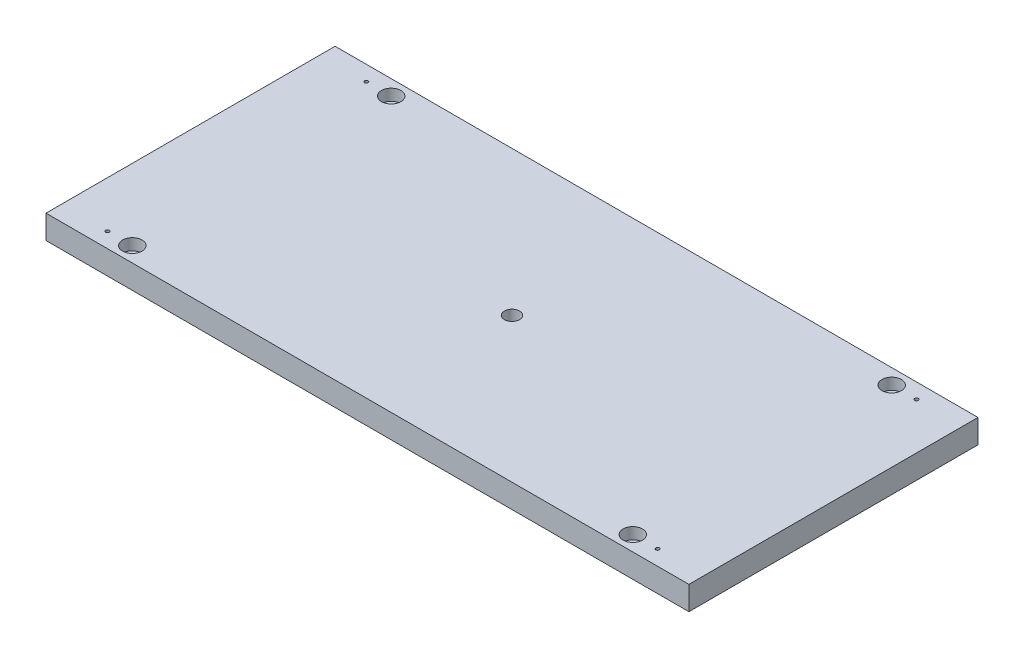
ISO-10303-21;
HEADER;
FILE_DESCRIPTION(('STEP AP214'),'2;1');
FILE_NAME('part.step','',(''),(''),'','','');
FILE_SCHEMA(('AUTOMOTIVE_DESIGN { 1 0 10303 214 1 1 1 1 }'));
ENDSEC;
DATA;
#1=APPLICATION_CONTEXT('core data for automotive mechanical design processes');
#2=APPLICATION_PROTOCOL_DEFINITION('international standard','automotive_design',2000,#1);
#3=PRODUCT_CONTEXT('',#1,'mechanical');
#4=PRODUCT('Part','Part','',(#3));
#5=PRODUCT_RELATED_PRODUCT_CATEGORY('part','',(#4));
#6=PRODUCT_DEFINITION_FORMATION('','',#4);
#7=PRODUCT_DEFINITION_CONTEXT('part definition',#1,'design');
#8=PRODUCT_DEFINITION('design','',#6,#7);
#9=PRODUCT_DEFINITION_SHAPE('','',#8);
#10=(LENGTH_UNIT() NAMED_UNIT(*) SI_UNIT(.MILLI.,.METRE.));
#11=(NAMED_UNIT(*) PLANE_ANGLE_UNIT() SI_UNIT($,.RADIAN.));
#12=(NAMED_UNIT(*) SI_UNIT($,.STERADIAN.) SOLID_ANGLE_UNIT());
#13=UNCERTAINTY_MEASURE_WITH_UNIT(LENGTH_MEASURE(1.E-05),#10,'distance_accuracy_value','');
#14=(GEOMETRIC_REPRESENTATION_CONTEXT(3) GLOBAL_UNCERTAINTY_ASSIGNED_CONTEXT((#13)) GLOBAL_UNIT_ASSIGNED_CONTEXT((#10,
#11,#12)) REPRESENTATION_CONTEXT('',''));
#15=CARTESIAN_POINT('',(0.,0.,0.));
#16=DIRECTION('',(0.,0.,1.));
#17=DIRECTION('',(1.,0.,0.));
#18=AXIS2_PLACEMENT_3D('',#15,#16,#17);
#19=CARTESIAN_POINT('',(0.,22.,0.));
#20=DIRECTION('',(1.,0.,0.));
#21=DIRECTION('',(0.,0.,-1.));
#22=AXIS2_PLACEMENT_3D('',#19,#20,#21);
#23=PLANE('',#22);
#24=DIRECTION('',(0.,0.,1.));
#25=VECTOR('',#24,1.);
#26=CARTESIAN_POINT('',(0.,0.,0.));
#27=LINE('',#26,#25);
#28=CARTESIAN_POINT('',(0.,0.,-268.));
#29=VERTEX_POINT('',#28);
#30=CARTESIAN_POINT('',(0.,0.,0.));
#31=VERTEX_POINT('',#30);
#32=EDGE_CURVE('E184',#29,#31,#27,.T.);
#33=ORIENTED_EDGE('',*,*,#32,.T.);
#34=DIRECTION('',(0.,-1.,0.));
#35=VECTOR('',#34,1.);
#36=CARTESIAN_POINT('',(0.,22.,0.));
#37=LINE('',#36,#35);
#38=CARTESIAN_POINT('',(0.,22.,0.));
#39=VERTEX_POINT('',#38);
#40=EDGE_CURVE('E11',#39,#31,#37,.T.);
#41=ORIENTED_EDGE('',*,*,#40,.F.);
#42=DIRECTION('',(0.,0.,1.));
#43=VECTOR('',#42,1.);
#44=CARTESIAN_POINT('',(0.,22.,0.));
#45=LINE('',#44,#43);
#46=CARTESIAN_POINT('',(0.,22.,-268.));
#47=VERTEX_POINT('',#46);
#48=EDGE_CURVE('E185',#47,#39,#45,.T.);
#49=ORIENTED_EDGE('',*,*,#48,.F.);
#50=DIRECTION('',(0.,-1.,0.));
#51=VECTOR('',#50,1.);
#52=CARTESIAN_POINT('',(0.,22.,-268.));
#53=LINE('',#52,#51);
#54=EDGE_CURVE('E191',#47,#29,#53,.T.);
#55=ORIENTED_EDGE('',*,*,#54,.T.);
#56=EDGE_LOOP('',(#33,#41,#49,#55));
#57=FACE_BOUND('',#56,.T.);
#58=ADVANCED_FACE('F41',(#57),#23,.F.);
#59=CARTESIAN_POINT('',(0.,22.,0.));
#60=DIRECTION('',(0.,0.,-1.));
#61=DIRECTION('',(-1.,0.,0.));
#62=AXIS2_PLACEMENT_3D('',#59,#60,#61);
#63=PLANE('',#62);
#64=DIRECTION('',(1.,0.,0.));
#65=VECTOR('',#64,1.);
#66=CARTESIAN_POINT('',(0.,0.,0.));
#67=LINE('',#66,#65);
#68=CARTESIAN_POINT('',(596.000000000001,0.,0.));
#69=VERTEX_POINT('',#68);
#70=EDGE_CURVE('E194',#31,#69,#67,.T.);
#71=ORIENTED_EDGE('',*,*,#70,.T.);
#72=DIRECTION('',(0.,-1.,0.));
#73=VECTOR('',#72,1.);
#74=CARTESIAN_POINT('',(596.000000000001,22.,0.));
#75=LINE('',#74,#73);
#76=CARTESIAN_POINT('',(596.000000000001,22.,0.));
#77=VERTEX_POINT('',#76);
#78=EDGE_CURVE('E49',#77,#69,#75,.T.);
#79=ORIENTED_EDGE('',*,*,#78,.F.);
#80=DIRECTION('',(1.,0.,0.));
#81=VECTOR('',#80,1.);
#82=CARTESIAN_POINT('',(0.,22.,0.));
#83=LINE('',#82,#81);
#84=EDGE_CURVE('E88',#39,#77,#83,.T.);
#85=ORIENTED_EDGE('',*,*,#84,.F.);
#86=ORIENTED_EDGE('',*,*,#40,.T.);
#87=EDGE_LOOP('',(#71,#79,#85,#86));
#88=FACE_BOUND('',#87,.T.);
#89=ADVANCED_FACE('F218',(#88),#63,.F.);
#90=CARTESIAN_POINT('',(596.000000000001,22.,0.));
#91=DIRECTION('',(-1.,0.,0.));
#92=DIRECTION('',(0.,0.,1.));
#93=AXIS2_PLACEMENT_3D('',#90,#91,#92);
#94=PLANE('',#93);
#95=DIRECTION('',(0.,0.,-1.));
#96=VECTOR('',#95,1.);
#97=CARTESIAN_POINT('',(596.000000000001,0.,0.));
#98=LINE('',#97,#96);
#99=CARTESIAN_POINT('',(596.000000000001,0.,-268.));
#100=VERTEX_POINT('',#99);
#101=EDGE_CURVE('E75',#69,#100,#98,.T.);
#102=ORIENTED_EDGE('',*,*,#101,.T.);
#103=DIRECTION('',(0.,-1.,0.));
#104=VECTOR('',#103,1.);
#105=CARTESIAN_POINT('',(596.000000000001,22.,-268.));
#106=LINE('',#105,#104);
#107=CARTESIAN_POINT('',(596.000000000001,22.,-268.));
#108=VERTEX_POINT('',#107);
#109=EDGE_CURVE('E199',#108,#100,#106,.T.);
#110=ORIENTED_EDGE('',*,*,#109,.F.);
#111=DIRECTION('',(0.,0.,-1.));
#112=VECTOR('',#111,1.);
#113=CARTESIAN_POINT('',(596.000000000001,22.,0.));
#114=LINE('',#113,#112);
#115=EDGE_CURVE('E188',#77,#108,#114,.T.);
#116=ORIENTED_EDGE('',*,*,#115,.F.);
#117=ORIENTED_EDGE('',*,*,#78,.T.);
#118=EDGE_LOOP('',(#102,#110,#116,#117));
#119=FACE_BOUND('',#118,.T.);
#120=ADVANCED_FACE('F201',(#119),#94,.F.);
#121=CARTESIAN_POINT('',(0.,22.,-268.));
#122=DIRECTION('',(0.,0.,1.));
#123=DIRECTION('',(1.,0.,0.));
#124=AXIS2_PLACEMENT_3D('',#121,#122,#123);
#125=PLANE('',#124);
#126=DIRECTION('',(-1.,0.,0.));
#127=VECTOR('',#126,1.);
#128=CARTESIAN_POINT('',(0.,0.,-268.));
#129=LINE('',#128,#127);
#130=EDGE_CURVE('E81',#100,#29,#129,.T.);
#131=ORIENTED_EDGE('',*,*,#130,.T.);
#132=ORIENTED_EDGE('',*,*,#54,.F.);
#133=DIRECTION('',(-1.,0.,0.));
#134=VECTOR('',#133,1.);
#135=CARTESIAN_POINT('',(0.,22.,-268.));
#136=LINE('',#135,#134);
#137=EDGE_CURVE('E57',#108,#47,#136,.T.);
#138=ORIENTED_EDGE('',*,*,#137,.F.);
#139=ORIENTED_EDGE('',*,*,#109,.T.);
#140=EDGE_LOOP('',(#131,#132,#138,#139));
#141=FACE_BOUND('',#140,.T.);
#142=ADVANCED_FACE('F208',(#141),#125,.F.);
#143=CARTESIAN_POINT('',(0.,22.,0.));
#144=DIRECTION('',(0.,-1.,0.));
#145=DIRECTION('',(0.,0.,-1.));
#146=AXIS2_PLACEMENT_3D('',#143,#144,#145);
#147=PLANE('',#146);
#148=CARTESIAN_POINT('',(298.,22.,-134.));
#149=DIRECTION('',(0.,1.,0.));
#150=DIRECTION('',(0.,0.,1.));
#151=AXIS2_PLACEMENT_3D('',#148,#149,#150);
#152=CIRCLE('',#151,7.00000000000001);
#153=CARTESIAN_POINT('',(298.,22.,-127.));
#154=VERTEX_POINT('',#153);
#155=EDGE_CURVE('E433',#154,#154,#152,.T.);
#156=ORIENTED_EDGE('',*,*,#155,.F.);
#157=EDGE_LOOP('',(#156));
#158=FACE_BOUND('',#157,.T.);
#159=CARTESIAN_POINT('',(43.,22.,-14.));
#160=DIRECTION('',(0.,1.,0.));
#161=DIRECTION('',(0.,0.,1.));
#162=AXIS2_PLACEMENT_3D('',#159,#160,#161);
#163=CIRCLE('',#162,1.64999999999999);
#164=CARTESIAN_POINT('',(43.,22.,-12.35));
#165=VERTEX_POINT('',#164);
#166=EDGE_CURVE('E112',#165,#165,#163,.T.);
#167=ORIENTED_EDGE('',*,*,#166,.F.);
#168=EDGE_LOOP('',(#167));
#169=FACE_BOUND('',#168,.T.);
#170=CARTESIAN_POINT('',(43.,22.,-254.000000000001));
#171=DIRECTION('',(0.,1.,0.));
#172=DIRECTION('',(0.,0.,1.));
#173=AXIS2_PLACEMENT_3D('',#170,#171,#172);
#174=CIRCLE('',#173,1.64999999999999);
#175=CARTESIAN_POINT('',(43.,22.,-252.350000000001));
#176=VERTEX_POINT('',#175);
#177=EDGE_CURVE('E111',#176,#176,#174,.T.);
#178=ORIENTED_EDGE('',*,*,#177,.F.);
#179=EDGE_LOOP('',(#178));
#180=FACE_BOUND('',#179,.T.);
#181=CARTESIAN_POINT('',(553.000000000001,22.,-254.));
#182=DIRECTION('',(0.,1.,0.));
#183=DIRECTION('',(0.,0.,1.));
#184=AXIS2_PLACEMENT_3D('',#181,#182,#183);
#185=CIRCLE('',#184,1.65000000000004);
#186=CARTESIAN_POINT('',(553.000000000001,22.,-252.35));
#187=VERTEX_POINT('',#186);
#188=EDGE_CURVE('E124',#187,#187,#185,.T.);
#189=ORIENTED_EDGE('',*,*,#188,.F.);
#190=EDGE_LOOP('',(#189));
#191=FACE_BOUND('',#190,.T.);
#192=CARTESIAN_POINT('',(553.000000000001,22.,-14.));
#193=DIRECTION('',(0.,1.,0.));
#194=DIRECTION('',(0.,0.,1.));
#195=AXIS2_PLACEMENT_3D('',#192,#193,#194);
#196=CIRCLE('',#195,1.65000000000004);
#197=CARTESIAN_POINT('',(553.000000000001,22.,-12.35));
#198=VERTEX_POINT('',#197);
#199=EDGE_CURVE('E130',#198,#198,#196,.T.);
#200=ORIENTED_EDGE('',*,*,#199,.F.);
#201=EDGE_LOOP('',(#200));
#202=FACE_BOUND('',#201,.T.);
#203=CARTESIAN_POINT('',(66.,22.,-254.000000000001));
#204=DIRECTION('',(0.,1.,0.));
#205=DIRECTION('',(0.,0.,1.));
#206=AXIS2_PLACEMENT_3D('',#203,#204,#205);
#207=CIRCLE('',#206,9.00000000000001);
#208=CARTESIAN_POINT('',(66.,22.,-245.000000000001));
#209=VERTEX_POINT('',#208);
#210=EDGE_CURVE('E136',#209,#209,#207,.T.);
#211=ORIENTED_EDGE('',*,*,#210,.F.);
#212=EDGE_LOOP('',(#211));
#213=FACE_BOUND('',#212,.T.);
#214=CARTESIAN_POINT('',(65.9999999999999,22.,-14.));
#215=DIRECTION('',(0.,1.,0.));
#216=DIRECTION('',(0.,0.,1.));
#217=AXIS2_PLACEMENT_3D('',#214,#215,#216);
#218=CIRCLE('',#217,9.00000000000001);
#219=CARTESIAN_POINT('',(65.9999999999999,22.,-4.99999999999999));
#220=VERTEX_POINT('',#219);
#221=EDGE_CURVE('E148',#220,#220,#218,.T.);
#222=ORIENTED_EDGE('',*,*,#221,.F.);
#223=EDGE_LOOP('',(#222));
#224=FACE_BOUND('',#223,.T.);
#225=CARTESIAN_POINT('',(530.000000000001,22.,-14.0000000000001));
#226=DIRECTION('',(0.,1.,0.));
#227=DIRECTION('',(0.,0.,1.));
#228=AXIS2_PLACEMENT_3D('',#225,#226,#227);
#229=CIRCLE('',#228,9.00000000000001);
#230=CARTESIAN_POINT('',(530.000000000001,22.,-5.00000000000005));
#231=VERTEX_POINT('',#230);
#232=EDGE_CURVE('E160',#231,#231,#229,.T.);
#233=ORIENTED_EDGE('',*,*,#232,.F.);
#234=EDGE_LOOP('',(#233));
#235=FACE_BOUND('',#234,.T.);
#236=CARTESIAN_POINT('',(530.000000000001,22.,-254.000000000001));
#237=DIRECTION('',(0.,1.,0.));
#238=DIRECTION('',(0.,0.,1.));
#239=AXIS2_PLACEMENT_3D('',#236,#237,#238);
#240=CIRCLE('',#239,9.00000000000001);
#241=CARTESIAN_POINT('',(530.000000000001,22.,-245.000000000001));
#242=VERTEX_POINT('',#241);
#243=EDGE_CURVE('E172',#242,#242,#240,.T.);
#244=ORIENTED_EDGE('',*,*,#243,.F.);
#245=EDGE_LOOP('',(#244));
#246=FACE_BOUND('',#245,.T.);
#247=ORIENTED_EDGE('',*,*,#48,.T.);
#248=ORIENTED_EDGE('',*,*,#84,.T.);
#249=ORIENTED_EDGE('',*,*,#115,.T.);
#250=ORIENTED_EDGE('',*,*,#137,.T.);
#251=EDGE_LOOP('',(#247,#248,#249,#250));
#252=FACE_BOUND('',#251,.T.);
#253=ADVANCED_FACE('F210',(#158,#169,#180,#191,#202,#213,#224,#235,#246,#252),#147,.F.);
#254=CARTESIAN_POINT('',(0.,0.,0.));
#255=DIRECTION('',(0.,-1.,0.));
#256=DIRECTION('',(0.,0.,-1.));
#257=AXIS2_PLACEMENT_3D('',#254,#255,#256);
#258=PLANE('',#257);
#259=CARTESIAN_POINT('',(298.,0.,-134.));
#260=DIRECTION('',(0.,1.,0.));
#261=DIRECTION('',(0.,0.,1.));
#262=AXIS2_PLACEMENT_3D('',#259,#260,#261);
#263=CIRCLE('',#262,7.00000000000001);
#264=CARTESIAN_POINT('',(298.,0.,-127.));
#265=VERTEX_POINT('',#264);
#266=EDGE_CURVE('E118',#265,#265,#263,.T.);
#267=ORIENTED_EDGE('',*,*,#266,.T.);
#268=EDGE_LOOP('',(#267));
#269=FACE_BOUND('',#268,.T.);
#270=CARTESIAN_POINT('',(66.,0.,-254.000000000001));
#271=DIRECTION('',(0.,1.,0.));
#272=DIRECTION('',(0.,0.,1.));
#273=AXIS2_PLACEMENT_3D('',#270,#271,#272);
#274=CIRCLE('',#273,5.49999999999999);
#275=CARTESIAN_POINT('',(66.,0.,-248.500000000001));
#276=VERTEX_POINT('',#275);
#277=EDGE_CURVE('E145',#276,#276,#274,.T.);
#278=ORIENTED_EDGE('',*,*,#277,.T.);
#279=EDGE_LOOP('',(#278));
#280=FACE_BOUND('',#279,.T.);
#281=CARTESIAN_POINT('',(65.9999999999999,0.,-14.));
#282=DIRECTION('',(0.,1.,0.));
#283=DIRECTION('',(0.,0.,1.));
#284=AXIS2_PLACEMENT_3D('',#281,#282,#283);
#285=CIRCLE('',#284,5.49999999999999);
#286=CARTESIAN_POINT('',(65.9999999999999,0.,-8.50000000000001));
#287=VERTEX_POINT('',#286);
#288=EDGE_CURVE('E157',#287,#287,#285,.T.);
#289=ORIENTED_EDGE('',*,*,#288,.T.);
#290=EDGE_LOOP('',(#289));
#291=FACE_BOUND('',#290,.T.);
#292=CARTESIAN_POINT('',(530.000000000001,0.,-14.0000000000001));
#293=DIRECTION('',(0.,1.,0.));
#294=DIRECTION('',(0.,0.,1.));
#295=AXIS2_PLACEMENT_3D('',#292,#293,#294);
#296=CIRCLE('',#295,5.49999999999995);
#297=CARTESIAN_POINT('',(530.000000000001,0.,-8.50000000000011));
#298=VERTEX_POINT('',#297);
#299=EDGE_CURVE('E169',#298,#298,#296,.T.);
#300=ORIENTED_EDGE('',*,*,#299,.T.);
#301=EDGE_LOOP('',(#300));
#302=FACE_BOUND('',#301,.T.);
#303=CARTESIAN_POINT('',(530.000000000001,0.,-254.000000000001));
#304=DIRECTION('',(0.,1.,0.));
#305=DIRECTION('',(0.,0.,1.));
#306=AXIS2_PLACEMENT_3D('',#303,#304,#305);
#307=CIRCLE('',#306,5.49999999999995);
#308=CARTESIAN_POINT('',(530.000000000001,0.,-248.500000000001));
#309=VERTEX_POINT('',#308);
#310=EDGE_CURVE('E181',#309,#309,#307,.T.);
#311=ORIENTED_EDGE('',*,*,#310,.T.);
#312=EDGE_LOOP('',(#311));
#313=FACE_BOUND('',#312,.T.);
#314=ORIENTED_EDGE('',*,*,#32,.F.);
#315=ORIENTED_EDGE('',*,*,#130,.F.);
#316=ORIENTED_EDGE('',*,*,#101,.F.);
#317=ORIENTED_EDGE('',*,*,#70,.F.);
#318=EDGE_LOOP('',(#314,#315,#316,#317));
#319=FACE_BOUND('',#318,.T.);
#320=ADVANCED_FACE('F204',(#269,#280,#291,#302,#313,#319),#258,.T.);
#321=CARTESIAN_POINT('',(530.000000000001,22.,-254.000000000001));
#322=DIRECTION('',(0.,1.,0.));
#323=DIRECTION('',(0.,0.,1.));
#324=AXIS2_PLACEMENT_3D('',#321,#322,#323);
#325=CYLINDRICAL_SURFACE('',#324,5.49999999999995);
#326=ORIENTED_EDGE('',*,*,#310,.F.);
#327=EDGE_LOOP('',(#326));
#328=FACE_BOUND('',#327,.T.);
#329=CARTESIAN_POINT('',(530.000000000001,11.4,-254.000000000001));
#330=DIRECTION('',(0.,1.,0.));
#331=DIRECTION('',(0.,0.,1.));
#332=AXIS2_PLACEMENT_3D('',#329,#330,#331);
#333=CIRCLE('',#332,5.49999999999995);
#334=CARTESIAN_POINT('',(530.000000000001,11.4,-248.500000000001));
#335=VERTEX_POINT('',#334);
#336=EDGE_CURVE('E178',#335,#335,#333,.T.);
#337=ORIENTED_EDGE('',*,*,#336,.T.);
#338=EDGE_LOOP('',(#337));
#339=FACE_BOUND('',#338,.T.);
#340=ADVANCED_FACE('F244',(#328,#339),#325,.F.);
#341=CARTESIAN_POINT('',(535.500000000001,11.4,-254.000000000001));
#342=DIRECTION('',(0.,-1.,0.));
#343=DIRECTION('',(0.,0.,-1.));
#344=AXIS2_PLACEMENT_3D('',#341,#342,#343);
#345=PLANE('',#344);
#346=ORIENTED_EDGE('',*,*,#336,.F.);
#347=EDGE_LOOP('',(#346));
#348=FACE_BOUND('',#347,.T.);
#349=CARTESIAN_POINT('',(530.000000000001,11.4,-254.000000000001));
#350=DIRECTION('',(0.,1.,0.));
#351=DIRECTION('',(0.,0.,1.));
#352=AXIS2_PLACEMENT_3D('',#349,#350,#351);
#353=CIRCLE('',#352,9.00000000000001);
#354=CARTESIAN_POINT('',(530.000000000001,11.4,-245.000000000001));
#355=VERTEX_POINT('',#354);
#356=EDGE_CURVE('E175',#355,#355,#353,.T.);
#357=ORIENTED_EDGE('',*,*,#356,.T.);
#358=EDGE_LOOP('',(#357));
#359=FACE_BOUND('',#358,.T.);
#360=ADVANCED_FACE('F251',(#348,#359),#345,.F.);
#361=CARTESIAN_POINT('',(530.000000000001,22.,-254.000000000001));
#362=DIRECTION('',(0.,1.,0.));
#363=DIRECTION('',(0.,0.,1.));
#364=AXIS2_PLACEMENT_3D('',#361,#362,#363);
#365=CYLINDRICAL_SURFACE('',#364,9.00000000000001);
#366=ORIENTED_EDGE('',*,*,#356,.F.);
#367=EDGE_LOOP('',(#366));
#368=FACE_BOUND('',#367,.T.);
#369=ORIENTED_EDGE('',*,*,#243,.T.);
#370=EDGE_LOOP('',(#369));
#371=FACE_BOUND('',#370,.T.);
#372=ADVANCED_FACE('F259',(#368,#371),#365,.F.);
#373=CARTESIAN_POINT('',(530.000000000001,22.,-14.0000000000001));
#374=DIRECTION('',(0.,1.,0.));
#375=DIRECTION('',(0.,0.,1.));
#376=AXIS2_PLACEMENT_3D('',#373,#374,#375);
#377=CYLINDRICAL_SURFACE('',#376,5.49999999999995);
#378=ORIENTED_EDGE('',*,*,#299,.F.);
#379=EDGE_LOOP('',(#378));
#380=FACE_BOUND('',#379,.T.);
#381=CARTESIAN_POINT('',(530.000000000001,11.4,-14.0000000000001));
#382=DIRECTION('',(0.,1.,0.));
#383=DIRECTION('',(0.,0.,1.));
#384=AXIS2_PLACEMENT_3D('',#381,#382,#383);
#385=CIRCLE('',#384,5.49999999999995);
#386=CARTESIAN_POINT('',(530.000000000001,11.4,-8.50000000000011));
#387=VERTEX_POINT('',#386);
#388=EDGE_CURVE('E166',#387,#387,#385,.T.);
#389=ORIENTED_EDGE('',*,*,#388,.T.);
#390=EDGE_LOOP('',(#389));
#391=FACE_BOUND('',#390,.T.);
#392=ADVANCED_FACE('F268',(#380,#391),#377,.F.);
#393=CARTESIAN_POINT('',(535.500000000001,11.4,-14.0000000000002));
#394=DIRECTION('',(0.,-1.,0.));
#395=DIRECTION('',(0.,0.,-1.));
#396=AXIS2_PLACEMENT_3D('',#393,#394,#395);
#397=PLANE('',#396);
#398=ORIENTED_EDGE('',*,*,#388,.F.);
#399=EDGE_LOOP('',(#398));
#400=FACE_BOUND('',#399,.T.);
#401=CARTESIAN_POINT('',(530.000000000001,11.4,-14.0000000000001));
#402=DIRECTION('',(0.,1.,0.));
#403=DIRECTION('',(0.,0.,1.));
#404=AXIS2_PLACEMENT_3D('',#401,#402,#403);
#405=CIRCLE('',#404,9.00000000000001);
#406=CARTESIAN_POINT('',(530.000000000001,11.4,-5.00000000000005));
#407=VERTEX_POINT('',#406);
#408=EDGE_CURVE('E163',#407,#407,#405,.T.);
#409=ORIENTED_EDGE('',*,*,#408,.T.);
#410=EDGE_LOOP('',(#409));
#411=FACE_BOUND('',#410,.T.);
#412=ADVANCED_FACE('F278',(#400,#411),#397,.F.);
#413=CARTESIAN_POINT('',(530.000000000001,22.,-14.0000000000001));
#414=DIRECTION('',(0.,1.,0.));
#415=DIRECTION('',(0.,0.,1.));
#416=AXIS2_PLACEMENT_3D('',#413,#414,#415);
#417=CYLINDRICAL_SURFACE('',#416,9.00000000000001);
#418=ORIENTED_EDGE('',*,*,#408,.F.);
#419=EDGE_LOOP('',(#418));
#420=FACE_BOUND('',#419,.T.);
#421=ORIENTED_EDGE('',*,*,#232,.T.);
#422=EDGE_LOOP('',(#421));
#423=FACE_BOUND('',#422,.T.);
#424=ADVANCED_FACE('F286',(#420,#423),#417,.F.);
#425=CARTESIAN_POINT('',(65.9999999999999,22.,-14.));
#426=DIRECTION('',(0.,1.,0.));
#427=DIRECTION('',(0.,0.,1.));
#428=AXIS2_PLACEMENT_3D('',#425,#426,#427);
#429=CYLINDRICAL_SURFACE('',#428,5.5);
#430=ORIENTED_EDGE('',*,*,#288,.F.);
#431=EDGE_LOOP('',(#430));
#432=FACE_BOUND('',#431,.T.);
#433=CARTESIAN_POINT('',(65.9999999999999,11.4,-14.));
#434=DIRECTION('',(0.,1.,0.));
#435=DIRECTION('',(0.,0.,1.));
#436=AXIS2_PLACEMENT_3D('',#433,#434,#435);
#437=CIRCLE('',#436,5.50000000000001);
#438=CARTESIAN_POINT('',(65.9999999999999,11.4,-8.5));
#439=VERTEX_POINT('',#438);
#440=EDGE_CURVE('E154',#439,#439,#437,.T.);
#441=ORIENTED_EDGE('',*,*,#440,.T.);
#442=EDGE_LOOP('',(#441));
#443=FACE_BOUND('',#442,.T.);
#444=ADVANCED_FACE('F294',(#432,#443),#429,.F.);
#445=CARTESIAN_POINT('',(71.5,11.4,-14.));
#446=DIRECTION('',(0.,-1.,0.));
#447=DIRECTION('',(0.,0.,-1.));
#448=AXIS2_PLACEMENT_3D('',#445,#446,#447);
#449=PLANE('',#448);
#450=ORIENTED_EDGE('',*,*,#440,.F.);
#451=EDGE_LOOP('',(#450));
#452=FACE_BOUND('',#451,.T.);
#453=CARTESIAN_POINT('',(65.9999999999999,11.4,-14.));
#454=DIRECTION('',(0.,1.,0.));
#455=DIRECTION('',(0.,0.,1.));
#456=AXIS2_PLACEMENT_3D('',#453,#454,#455);
#457=CIRCLE('',#456,9.00000000000001);
#458=CARTESIAN_POINT('',(65.9999999999999,11.4,-4.99999999999999));
#459=VERTEX_POINT('',#458);
#460=EDGE_CURVE('E151',#459,#459,#457,.T.);
#461=ORIENTED_EDGE('',*,*,#460,.T.);
#462=EDGE_LOOP('',(#461));
#463=FACE_BOUND('',#462,.T.);
#464=ADVANCED_FACE('F303',(#452,#463),#449,.F.);
#465=CARTESIAN_POINT('',(65.9999999999999,22.,-14.));
#466=DIRECTION('',(0.,1.,0.));
#467=DIRECTION('',(0.,0.,1.));
#468=AXIS2_PLACEMENT_3D('',#465,#466,#467);
#469=CYLINDRICAL_SURFACE('',#468,9.00000000000001);
#470=ORIENTED_EDGE('',*,*,#460,.F.);
#471=EDGE_LOOP('',(#470));
#472=FACE_BOUND('',#471,.T.);
#473=ORIENTED_EDGE('',*,*,#221,.T.);
#474=EDGE_LOOP('',(#473));
#475=FACE_BOUND('',#474,.T.);
#476=ADVANCED_FACE('F311',(#472,#475),#469,.F.);
#477=CARTESIAN_POINT('',(66.,22.,-254.000000000001));
#478=DIRECTION('',(0.,1.,0.));
#479=DIRECTION('',(0.,0.,1.));
#480=AXIS2_PLACEMENT_3D('',#477,#478,#479);
#481=CYLINDRICAL_SURFACE('',#480,5.5);
#482=ORIENTED_EDGE('',*,*,#277,.F.);
#483=EDGE_LOOP('',(#482));
#484=FACE_BOUND('',#483,.T.);
#485=CARTESIAN_POINT('',(66.,11.4,-254.000000000001));
#486=DIRECTION('',(0.,1.,0.));
#487=DIRECTION('',(0.,0.,1.));
#488=AXIS2_PLACEMENT_3D('',#485,#486,#487);
#489=CIRCLE('',#488,5.50000000000001);
#490=CARTESIAN_POINT('',(66.,11.4,-248.500000000001));
#491=VERTEX_POINT('',#490);
#492=EDGE_CURVE('E142',#491,#491,#489,.T.);
#493=ORIENTED_EDGE('',*,*,#492,.T.);
#494=EDGE_LOOP('',(#493));
#495=FACE_BOUND('',#494,.T.);
#496=ADVANCED_FACE('F319',(#484,#495),#481,.F.);
#497=CARTESIAN_POINT('',(71.5,11.4,-254.000000000001));
#498=DIRECTION('',(0.,-1.,0.));
#499=DIRECTION('',(0.,0.,-1.));
#500=AXIS2_PLACEMENT_3D('',#497,#498,#499);
#501=PLANE('',#500);
#502=ORIENTED_EDGE('',*,*,#492,.F.);
#503=EDGE_LOOP('',(#502));
#504=FACE_BOUND('',#503,.T.);
#505=CARTESIAN_POINT('',(66.,11.4,-254.000000000001));
#506=DIRECTION('',(0.,1.,0.));
#507=DIRECTION('',(0.,0.,1.));
#508=AXIS2_PLACEMENT_3D('',#505,#506,#507);
#509=CIRCLE('',#508,9.00000000000001);
#510=CARTESIAN_POINT('',(66.,11.4,-245.000000000001));
#511=VERTEX_POINT('',#510);
#512=EDGE_CURVE('E139',#511,#511,#509,.T.);
#513=ORIENTED_EDGE('',*,*,#512,.T.);
#514=EDGE_LOOP('',(#513));
#515=FACE_BOUND('',#514,.T.);
#516=ADVANCED_FACE('F328',(#504,#515),#501,.F.);
#517=CARTESIAN_POINT('',(66.,22.,-254.000000000001));
#518=DIRECTION('',(0.,1.,0.));
#519=DIRECTION('',(0.,0.,1.));
#520=AXIS2_PLACEMENT_3D('',#517,#518,#519);
#521=CYLINDRICAL_SURFACE('',#520,9.00000000000001);
#522=ORIENTED_EDGE('',*,*,#512,.F.);
#523=EDGE_LOOP('',(#522));
#524=FACE_BOUND('',#523,.T.);
#525=ORIENTED_EDGE('',*,*,#210,.T.);
#526=EDGE_LOOP('',(#525));
#527=FACE_BOUND('',#526,.T.);
#528=ADVANCED_FACE('F336',(#524,#527),#521,.F.);
#529=CARTESIAN_POINT('',(553.000000000001,10.5,-14.));
#530=DIRECTION('',(0.,1.,0.));
#531=DIRECTION('',(0.,0.,1.));
#532=AXIS2_PLACEMENT_3D('',#529,#530,#531);
#533=CONICAL_SURFACE('',#532,1.65000000000004,1.02974425867666);
#534=CARTESIAN_POINT('',(553.000000000001,9.50857997860452,-14.));
#535=VERTEX_POINT('',#534);
#536=VERTEX_LOOP('',#535);
#537=FACE_BOUND('',#536,.T.);
#538=CARTESIAN_POINT('',(553.000000000001,10.5,-14.));
#539=DIRECTION('',(0.,1.,0.));
#540=DIRECTION('',(0.,0.,1.));
#541=AXIS2_PLACEMENT_3D('',#538,#539,#540);
#542=CIRCLE('',#541,1.65000000000004);
#543=CARTESIAN_POINT('',(553.000000000001,10.5,-12.35));
#544=VERTEX_POINT('',#543);
#545=EDGE_CURVE('E133',#544,#544,#542,.T.);
#546=ORIENTED_EDGE('',*,*,#545,.T.);
#547=EDGE_LOOP('',(#546));
#548=FACE_BOUND('',#547,.T.);
#549=ADVANCED_FACE('F344',(#537,#548),#533,.F.);
#550=CARTESIAN_POINT('',(553.000000000001,22.,-14.));
#551=DIRECTION('',(0.,1.,0.));
#552=DIRECTION('',(0.,0.,1.));
#553=AXIS2_PLACEMENT_3D('',#550,#551,#552);
#554=CYLINDRICAL_SURFACE('',#553,1.65000000000004);
#555=ORIENTED_EDGE('',*,*,#545,.F.);
#556=EDGE_LOOP('',(#555));
#557=FACE_BOUND('',#556,.T.);
#558=ORIENTED_EDGE('',*,*,#199,.T.);
#559=EDGE_LOOP('',(#558));
#560=FACE_BOUND('',#559,.T.);
#561=ADVANCED_FACE('F352',(#557,#560),#554,.F.);
#562=CARTESIAN_POINT('',(553.000000000001,10.5,-254.));
#563=DIRECTION('',(0.,1.,0.));
#564=DIRECTION('',(0.,0.,1.));
#565=AXIS2_PLACEMENT_3D('',#562,#563,#564);
#566=CONICAL_SURFACE('',#565,1.65000000000004,1.02974425867666);
#567=CARTESIAN_POINT('',(553.000000000001,9.50857997860452,-254.));
#568=VERTEX_POINT('',#567);
#569=VERTEX_LOOP('',#568);
#570=FACE_BOUND('',#569,.T.);
#571=CARTESIAN_POINT('',(553.000000000001,10.5,-254.));
#572=DIRECTION('',(0.,1.,0.));
#573=DIRECTION('',(0.,0.,1.));
#574=AXIS2_PLACEMENT_3D('',#571,#572,#573);
#575=CIRCLE('',#574,1.65000000000004);
#576=CARTESIAN_POINT('',(553.000000000001,10.5,-252.35));
#577=VERTEX_POINT('',#576);
#578=EDGE_CURVE('E127',#577,#577,#575,.T.);
#579=ORIENTED_EDGE('',*,*,#578,.T.);
#580=EDGE_LOOP('',(#579));
#581=FACE_BOUND('',#580,.T.);
#582=ADVANCED_FACE('F360',(#570,#581),#566,.F.);
#583=CARTESIAN_POINT('',(553.000000000001,22.,-254.));
#584=DIRECTION('',(0.,1.,0.));
#585=DIRECTION('',(0.,0.,1.));
#586=AXIS2_PLACEMENT_3D('',#583,#584,#585);
#587=CYLINDRICAL_SURFACE('',#586,1.65000000000004);
#588=ORIENTED_EDGE('',*,*,#578,.F.);
#589=EDGE_LOOP('',(#588));
#590=FACE_BOUND('',#589,.T.);
#591=ORIENTED_EDGE('',*,*,#188,.T.);
#592=EDGE_LOOP('',(#591));
#593=FACE_BOUND('',#592,.T.);
#594=ADVANCED_FACE('F370',(#590,#593),#587,.F.);
#595=CARTESIAN_POINT('',(43.,10.5,-254.000000000001));
#596=DIRECTION('',(0.,1.,0.));
#597=DIRECTION('',(0.,0.,1.));
#598=AXIS2_PLACEMENT_3D('',#595,#596,#597);
#599=CONICAL_SURFACE('',#598,1.64999999999998,1.02974425867665);
#600=CARTESIAN_POINT('',(43.,9.50857997860452,-254.000000000001));
#601=VERTEX_POINT('',#600);
#602=VERTEX_LOOP('',#601);
#603=FACE_BOUND('',#602,.T.);
#604=CARTESIAN_POINT('',(43.,10.5,-254.000000000001));
#605=DIRECTION('',(0.,1.,0.));
#606=DIRECTION('',(0.,0.,1.));
#607=AXIS2_PLACEMENT_3D('',#604,#605,#606);
#608=CIRCLE('',#607,1.64999999999998);
#609=CARTESIAN_POINT('',(43.,10.5,-252.350000000001));
#610=VERTEX_POINT('',#609);
#611=EDGE_CURVE('E115',#610,#610,#608,.T.);
#612=ORIENTED_EDGE('',*,*,#611,.T.);
#613=EDGE_LOOP('',(#612));
#614=FACE_BOUND('',#613,.T.);
#615=ADVANCED_FACE('F378',(#603,#614),#599,.F.);
#616=CARTESIAN_POINT('',(43.,22.,-254.000000000001));
#617=DIRECTION('',(0.,1.,0.));
#618=DIRECTION('',(0.,0.,1.));
#619=AXIS2_PLACEMENT_3D('',#616,#617,#618);
#620=CYLINDRICAL_SURFACE('',#619,1.64999999999999);
#621=ORIENTED_EDGE('',*,*,#611,.F.);
#622=EDGE_LOOP('',(#621));
#623=FACE_BOUND('',#622,.T.);
#624=ORIENTED_EDGE('',*,*,#177,.T.);
#625=EDGE_LOOP('',(#624));
#626=FACE_BOUND('',#625,.T.);
#627=ADVANCED_FACE('F105',(#623,#626),#620,.F.);
#628=CARTESIAN_POINT('',(43.,10.5,-14.));
#629=DIRECTION('',(0.,1.,0.));
#630=DIRECTION('',(0.,0.,1.));
#631=AXIS2_PLACEMENT_3D('',#628,#629,#630);
#632=CONICAL_SURFACE('',#631,1.64999999999998,1.02974425867665);
#633=CARTESIAN_POINT('',(43.,9.50857997860452,-14.));
#634=VERTEX_POINT('',#633);
#635=VERTEX_LOOP('',#634);
#636=FACE_BOUND('',#635,.T.);
#637=CARTESIAN_POINT('',(43.,10.5,-14.));
#638=DIRECTION('',(0.,1.,0.));
#639=DIRECTION('',(0.,0.,1.));
#640=AXIS2_PLACEMENT_3D('',#637,#638,#639);
#641=CIRCLE('',#640,1.64999999999998);
#642=CARTESIAN_POINT('',(43.,10.5,-12.35));
#643=VERTEX_POINT('',#642);
#644=EDGE_CURVE('E109',#643,#643,#641,.T.);
#645=ORIENTED_EDGE('',*,*,#644,.T.);
#646=EDGE_LOOP('',(#645));
#647=FACE_BOUND('',#646,.T.);
#648=ADVANCED_FACE('F101',(#636,#647),#632,.F.);
#649=CARTESIAN_POINT('',(43.,22.,-14.));
#650=DIRECTION('',(0.,1.,0.));
#651=DIRECTION('',(0.,0.,1.));
#652=AXIS2_PLACEMENT_3D('',#649,#650,#651);
#653=CYLINDRICAL_SURFACE('',#652,1.64999999999999);
#654=ORIENTED_EDGE('',*,*,#644,.F.);
#655=EDGE_LOOP('',(#654));
#656=FACE_BOUND('',#655,.T.);
#657=ORIENTED_EDGE('',*,*,#166,.T.);
#658=EDGE_LOOP('',(#657));
#659=FACE_BOUND('',#658,.T.);
#660=ADVANCED_FACE('F104',(#656,#659),#653,.F.);
#661=CARTESIAN_POINT('',(298.,22.,-134.));
#662=DIRECTION('',(0.,1.,0.));
#663=DIRECTION('',(0.,0.,1.));
#664=AXIS2_PLACEMENT_3D('',#661,#662,#663);
#665=CYLINDRICAL_SURFACE('',#664,7.00000000000001);
#666=ORIENTED_EDGE('',*,*,#266,.F.);
#667=EDGE_LOOP('',(#666));
#668=FACE_BOUND('',#667,.T.);
#669=ORIENTED_EDGE('',*,*,#155,.T.);
#670=EDGE_LOOP('',(#669));
#671=FACE_BOUND('',#670,.T.);
#672=ADVANCED_FACE('F408',(#668,#671),#665,.F.);
#673=CLOSED_SHELL('',(#58,#89,#120,#142,#253,#320,#340,#360,#372,#392,#412,#424,#444,#464,#476,
#496,#516,#528,#549,#561,#582,#594,#615,#627,#648,#660,#672));
#674=MANIFOLD_SOLID_BREP('B2',#673);
#675=ADVANCED_BREP_SHAPE_REPRESENTATION('',(#18,#674),#14);
#676=SHAPE_DEFINITION_REPRESENTATION(#9,#675);
ENDSEC;
END-ISO-10303-21;
